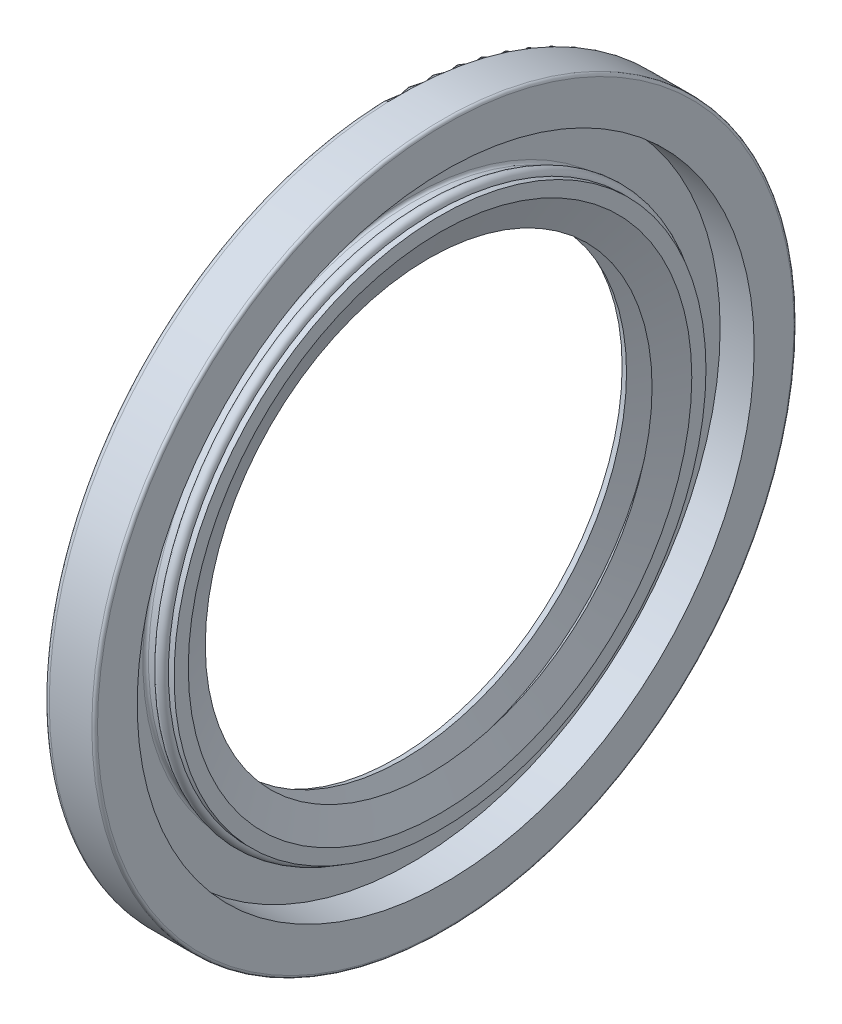
ISO-10303-21;
HEADER;
FILE_DESCRIPTION(('STEP AP214'),'2;1');
FILE_NAME('part.step','',(''),(''),'','','');
FILE_SCHEMA(('AUTOMOTIVE_DESIGN { 1 0 10303 214 1 1 1 1 }'));
ENDSEC;
DATA;
#1=APPLICATION_CONTEXT('core data for automotive mechanical design processes');
#2=APPLICATION_PROTOCOL_DEFINITION('international standard','automotive_design',2000,#1);
#3=PRODUCT_CONTEXT('',#1,'mechanical');
#4=PRODUCT('Part','Part','',(#3));
#5=PRODUCT_RELATED_PRODUCT_CATEGORY('part','',(#4));
#6=PRODUCT_DEFINITION_FORMATION('','',#4);
#7=PRODUCT_DEFINITION_CONTEXT('part definition',#1,'design');
#8=PRODUCT_DEFINITION('design','',#6,#7);
#9=PRODUCT_DEFINITION_SHAPE('','',#8);
#10=(LENGTH_UNIT() NAMED_UNIT(*) SI_UNIT(.MILLI.,.METRE.));
#11=(NAMED_UNIT(*) PLANE_ANGLE_UNIT() SI_UNIT($,.RADIAN.));
#12=(NAMED_UNIT(*) SI_UNIT($,.STERADIAN.) SOLID_ANGLE_UNIT());
#13=UNCERTAINTY_MEASURE_WITH_UNIT(LENGTH_MEASURE(1.E-05),#10,'distance_accuracy_value','');
#14=(GEOMETRIC_REPRESENTATION_CONTEXT(3) GLOBAL_UNCERTAINTY_ASSIGNED_CONTEXT((#13)) GLOBAL_UNIT_ASSIGNED_CONTEXT((#10,
#11,#12)) REPRESENTATION_CONTEXT('',''));
#15=CARTESIAN_POINT('',(0.,0.,0.));
#16=DIRECTION('',(0.,0.,1.));
#17=DIRECTION('',(1.,0.,0.));
#18=AXIS2_PLACEMENT_3D('',#15,#16,#17);
#19=CARTESIAN_POINT('',(0.,54.111111111111,0.));
#20=DIRECTION('',(-1.,0.,0.));
#21=DIRECTION('',(0.,0.,1.));
#22=AXIS2_PLACEMENT_3D('',#19,#20,#21);
#23=PLANE('',#22);
#24=CARTESIAN_POINT('',(0.,0.,0.));
#25=DIRECTION('',(1.,0.,0.));
#26=DIRECTION('',(0.,0.,-1.));
#27=AXIS2_PLACEMENT_3D('',#24,#25,#26);
#28=CIRCLE('',#27,48.333333333333);
#29=CARTESIAN_POINT('',(0.,0.,-48.333333333333));
#30=VERTEX_POINT('',#29);
#31=EDGE_CURVE('E108',#30,#30,#28,.T.);
#32=ORIENTED_EDGE('',*,*,#31,.T.);
#33=EDGE_LOOP('',(#32));
#34=FACE_BOUND('',#33,.T.);
#35=CARTESIAN_POINT('',(0.,0.,0.));
#36=DIRECTION('',(1.,0.,0.));
#37=DIRECTION('',(0.,0.,-1.));
#38=AXIS2_PLACEMENT_3D('',#35,#36,#37);
#39=CIRCLE('',#38,54.1111111111114);
#40=CARTESIAN_POINT('',(0.,0.,-54.1111111111114));
#41=VERTEX_POINT('',#40);
#42=EDGE_CURVE('E104',#41,#41,#39,.T.);
#43=ORIENTED_EDGE('',*,*,#42,.F.);
#44=EDGE_LOOP('',(#43));
#45=FACE_BOUND('',#44,.T.);
#46=ADVANCED_FACE('F15',(#34,#45),#23,.T.);
#47=CARTESIAN_POINT('',(8.,0.,0.));
#48=DIRECTION('',(1.,0.,0.));
#49=DIRECTION('',(0.,0.,-1.));
#50=AXIS2_PLACEMENT_3D('',#47,#48,#49);
#51=CYLINDRICAL_SURFACE('',#50,48.333333333333);
#52=CARTESIAN_POINT('',(0.2,0.,0.));
#53=DIRECTION('',(1.,0.,0.));
#54=DIRECTION('',(0.,0.,-1.));
#55=AXIS2_PLACEMENT_3D('',#52,#53,#54);
#56=CIRCLE('',#55,48.333333333333);
#57=CARTESIAN_POINT('',(0.2,0.,-48.333333333333));
#58=VERTEX_POINT('',#57);
#59=EDGE_CURVE('E100',#58,#58,#56,.T.);
#60=ORIENTED_EDGE('',*,*,#59,.T.);
#61=EDGE_LOOP('',(#60));
#62=FACE_BOUND('',#61,.T.);
#63=ORIENTED_EDGE('',*,*,#31,.F.);
#64=EDGE_LOOP('',(#63));
#65=FACE_BOUND('',#64,.T.);
#66=ADVANCED_FACE('F115',(#62,#65),#51,.F.);
#67=CARTESIAN_POINT('',(0.888888888888577,0.,0.));
#68=DIRECTION('',(1.,0.,0.));
#69=DIRECTION('',(0.,0.,-1.));
#70=AXIS2_PLACEMENT_3D('',#67,#68,#69);
#71=TOROIDAL_SURFACE('',#70,54.1111111111114,0.888888888888578);
#72=ORIENTED_EDGE('',*,*,#42,.T.);
#73=EDGE_LOOP('',(#72));
#74=FACE_BOUND('',#73,.T.);
#75=CARTESIAN_POINT('',(0.88888888888889,0.,0.));
#76=DIRECTION('',(1.,0.,0.));
#77=DIRECTION('',(0.,0.,-1.));
#78=AXIS2_PLACEMENT_3D('',#75,#76,#77);
#79=CIRCLE('',#78,55.);
#80=CARTESIAN_POINT('',(0.88888888888889,0.,-55.));
#81=VERTEX_POINT('',#80);
#82=EDGE_CURVE('E96',#81,#81,#79,.T.);
#83=ORIENTED_EDGE('',*,*,#82,.F.);
#84=EDGE_LOOP('',(#83));
#85=FACE_BOUND('',#84,.T.);
#86=ADVANCED_FACE('F117',(#74,#85),#71,.T.);
#87=CARTESIAN_POINT('',(0.2,48.333333333333,0.));
#88=DIRECTION('',(-1.,0.,0.));
#89=DIRECTION('',(0.,0.,1.));
#90=AXIS2_PLACEMENT_3D('',#87,#88,#89);
#91=PLANE('',#90);
#92=CARTESIAN_POINT('',(0.2,0.,0.));
#93=DIRECTION('',(1.,0.,0.));
#94=DIRECTION('',(0.,0.,-1.));
#95=AXIS2_PLACEMENT_3D('',#92,#93,#94);
#96=CIRCLE('',#95,41.666666666667);
#97=CARTESIAN_POINT('',(0.2,0.,-41.666666666667));
#98=VERTEX_POINT('',#97);
#99=EDGE_CURVE('E92',#98,#98,#96,.T.);
#100=ORIENTED_EDGE('',*,*,#99,.T.);
#101=EDGE_LOOP('',(#100));
#102=FACE_BOUND('',#101,.T.);
#103=ORIENTED_EDGE('',*,*,#59,.F.);
#104=EDGE_LOOP('',(#103));
#105=FACE_BOUND('',#104,.T.);
#106=ADVANCED_FACE('F125',(#102,#105),#91,.T.);
#107=CARTESIAN_POINT('',(8.,0.,0.));
#108=DIRECTION('',(1.,0.,0.));
#109=DIRECTION('',(0.,0.,-1.));
#110=AXIS2_PLACEMENT_3D('',#107,#108,#109);
#111=CYLINDRICAL_SURFACE('',#110,55.);
#112=ORIENTED_EDGE('',*,*,#82,.T.);
#113=EDGE_LOOP('',(#112));
#114=FACE_BOUND('',#113,.T.);
#115=CARTESIAN_POINT('',(7.5555555555556,0.,0.));
#116=DIRECTION('',(1.,0.,0.));
#117=DIRECTION('',(0.,0.,-1.));
#118=AXIS2_PLACEMENT_3D('',#115,#116,#117);
#119=CIRCLE('',#118,55.);
#120=CARTESIAN_POINT('',(7.5555555555556,0.,-55.));
#121=VERTEX_POINT('',#120);
#122=EDGE_CURVE('E88',#121,#121,#119,.T.);
#123=ORIENTED_EDGE('',*,*,#122,.F.);
#124=EDGE_LOOP('',(#123));
#125=FACE_BOUND('',#124,.T.);
#126=ADVANCED_FACE('F132',(#114,#125),#111,.T.);
#127=CARTESIAN_POINT('',(8.,0.,0.));
#128=DIRECTION('',(1.,0.,0.));
#129=DIRECTION('',(0.,0.,-1.));
#130=AXIS2_PLACEMENT_3D('',#127,#128,#129);
#131=CYLINDRICAL_SURFACE('',#130,41.666666666667);
#132=CARTESIAN_POINT('',(0.,0.,0.));
#133=DIRECTION('',(1.,0.,0.));
#134=DIRECTION('',(0.,0.,-1.));
#135=AXIS2_PLACEMENT_3D('',#132,#133,#134);
#136=CIRCLE('',#135,41.666666666667);
#137=CARTESIAN_POINT('',(0.,0.,-41.666666666667));
#138=VERTEX_POINT('',#137);
#139=EDGE_CURVE('E84',#138,#138,#136,.T.);
#140=ORIENTED_EDGE('',*,*,#139,.T.);
#141=EDGE_LOOP('',(#140));
#142=FACE_BOUND('',#141,.T.);
#143=ORIENTED_EDGE('',*,*,#99,.F.);
#144=EDGE_LOOP('',(#143));
#145=FACE_BOUND('',#144,.T.);
#146=ADVANCED_FACE('F136',(#142,#145),#131,.T.);
#147=CARTESIAN_POINT('',(7.5555555555557,0.,0.));
#148=DIRECTION('',(1.,0.,0.));
#149=DIRECTION('',(0.,0.,-1.));
#150=AXIS2_PLACEMENT_3D('',#147,#148,#149);
#151=TOROIDAL_SURFACE('',#150,54.5555555555557,0.444444444444303);
#152=ORIENTED_EDGE('',*,*,#122,.T.);
#153=EDGE_LOOP('',(#152));
#154=FACE_BOUND('',#153,.T.);
#155=CARTESIAN_POINT('',(8.,0.,0.));
#156=DIRECTION('',(1.,0.,0.));
#157=DIRECTION('',(0.,0.,-1.));
#158=AXIS2_PLACEMENT_3D('',#155,#156,#157);
#159=CIRCLE('',#158,54.5555556081221);
#160=CARTESIAN_POINT('',(8.,0.,-54.5555556081221));
#161=VERTEX_POINT('',#160);
#162=EDGE_CURVE('E80',#161,#161,#159,.T.);
#163=ORIENTED_EDGE('',*,*,#162,.F.);
#164=EDGE_LOOP('',(#163));
#165=FACE_BOUND('',#164,.T.);
#166=ADVANCED_FACE('F140',(#154,#165),#151,.T.);
#167=CARTESIAN_POINT('',(0.,41.666666666667,0.));
#168=DIRECTION('',(-1.,0.,0.));
#169=DIRECTION('',(0.,0.,1.));
#170=AXIS2_PLACEMENT_3D('',#167,#168,#169);
#171=PLANE('',#170);
#172=CARTESIAN_POINT('',(0.,0.,0.));
#173=DIRECTION('',(1.,0.,0.));
#174=DIRECTION('',(0.,0.,-1.));
#175=AXIS2_PLACEMENT_3D('',#172,#173,#174);
#176=CIRCLE('',#175,40.);
#177=CARTESIAN_POINT('',(0.,0.,-40.));
#178=VERTEX_POINT('',#177);
#179=EDGE_CURVE('E76',#178,#178,#176,.T.);
#180=ORIENTED_EDGE('',*,*,#179,.T.);
#181=EDGE_LOOP('',(#180));
#182=FACE_BOUND('',#181,.T.);
#183=ORIENTED_EDGE('',*,*,#139,.F.);
#184=EDGE_LOOP('',(#183));
#185=FACE_BOUND('',#184,.T.);
#186=ADVANCED_FACE('F144',(#182,#185),#171,.T.);
#187=CARTESIAN_POINT('',(8.,48.333333333333,0.));
#188=DIRECTION('',(1.,0.,0.));
#189=DIRECTION('',(0.,0.,-1.));
#190=AXIS2_PLACEMENT_3D('',#187,#188,#189);
#191=PLANE('',#190);
#192=ORIENTED_EDGE('',*,*,#162,.T.);
#193=EDGE_LOOP('',(#192));
#194=FACE_BOUND('',#193,.T.);
#195=CARTESIAN_POINT('',(8.,0.,0.));
#196=DIRECTION('',(1.,0.,0.));
#197=DIRECTION('',(0.,0.,-1.));
#198=AXIS2_PLACEMENT_3D('',#195,#196,#197);
#199=CIRCLE('',#198,48.333333333333);
#200=CARTESIAN_POINT('',(8.,0.,-48.333333333333));
#201=VERTEX_POINT('',#200);
#202=EDGE_CURVE('E72',#201,#201,#199,.T.);
#203=ORIENTED_EDGE('',*,*,#202,.F.);
#204=EDGE_LOOP('',(#203));
#205=FACE_BOUND('',#204,.T.);
#206=ADVANCED_FACE('F148',(#194,#205),#191,.T.);
#207=CARTESIAN_POINT('',(0.,0.,0.));
#208=DIRECTION('',(-1.,0.,0.));
#209=DIRECTION('',(0.,0.,1.));
#210=AXIS2_PLACEMENT_3D('',#207,#208,#209);
#211=CONICAL_SURFACE('',#210,40.,0.896055384571452);
#212=CARTESIAN_POINT('',(1.3333333333333,0.,0.));
#213=DIRECTION('',(1.,0.,0.));
#214=DIRECTION('',(0.,0.,-1.));
#215=AXIS2_PLACEMENT_3D('',#212,#213,#214);
#216=CIRCLE('',#215,38.333333333333);
#217=CARTESIAN_POINT('',(1.3333333333333,0.,-38.333333333333));
#218=VERTEX_POINT('',#217);
#219=EDGE_CURVE('E68',#218,#218,#216,.T.);
#220=ORIENTED_EDGE('',*,*,#219,.T.);
#221=EDGE_LOOP('',(#220));
#222=FACE_BOUND('',#221,.T.);
#223=ORIENTED_EDGE('',*,*,#179,.F.);
#224=EDGE_LOOP('',(#223));
#225=FACE_BOUND('',#224,.T.);
#226=ADVANCED_FACE('F152',(#222,#225),#211,.F.);
#227=CARTESIAN_POINT('',(8.,0.,0.));
#228=DIRECTION('',(1.,0.,0.));
#229=DIRECTION('',(0.,0.,-1.));
#230=AXIS2_PLACEMENT_3D('',#227,#228,#229);
#231=CYLINDRICAL_SURFACE('',#230,48.333333333333);
#232=ORIENTED_EDGE('',*,*,#202,.T.);
#233=EDGE_LOOP('',(#232));
#234=FACE_BOUND('',#233,.T.);
#235=CARTESIAN_POINT('',(2.6666666666667,0.,0.));
#236=DIRECTION('',(1.,0.,0.));
#237=DIRECTION('',(0.,0.,-1.));
#238=AXIS2_PLACEMENT_3D('',#235,#236,#237);
#239=CIRCLE('',#238,48.333333333333);
#240=CARTESIAN_POINT('',(2.6666666666667,0.,-48.333333333333));
#241=VERTEX_POINT('',#240);
#242=EDGE_CURVE('E64',#241,#241,#239,.T.);
#243=ORIENTED_EDGE('',*,*,#242,.F.);
#244=EDGE_LOOP('',(#243));
#245=FACE_BOUND('',#244,.T.);
#246=ADVANCED_FACE('F156',(#234,#245),#231,.F.);
#247=CARTESIAN_POINT('',(1.3333333333333,0.,0.));
#248=DIRECTION('',(1.,0.,0.));
#249=DIRECTION('',(0.,0.,-1.));
#250=AXIS2_PLACEMENT_3D('',#247,#248,#249);
#251=CONICAL_SURFACE('',#250,38.333333333333,1.19028994968245);
#252=CARTESIAN_POINT('',(0.183908045977011,0.,0.));
#253=DIRECTION('',(1.,0.,0.));
#254=DIRECTION('',(0.,0.,-1.));
#255=AXIS2_PLACEMENT_3D('',#252,#253,#254);
#256=CIRCLE('',#255,35.459770114943);
#257=CARTESIAN_POINT('',(0.183908045977011,0.,-35.459770114943));
#258=VERTEX_POINT('',#257);
#259=EDGE_CURVE('E60',#258,#258,#256,.T.);
#260=ORIENTED_EDGE('',*,*,#259,.T.);
#261=EDGE_LOOP('',(#260));
#262=FACE_BOUND('',#261,.T.);
#263=ORIENTED_EDGE('',*,*,#219,.F.);
#264=EDGE_LOOP('',(#263));
#265=FACE_BOUND('',#264,.T.);
#266=ADVANCED_FACE('F160',(#262,#265),#251,.T.);
#267=CARTESIAN_POINT('',(2.6666666666667,42.111111166667,0.));
#268=DIRECTION('',(1.,0.,0.));
#269=DIRECTION('',(0.,0.,-1.));
#270=AXIS2_PLACEMENT_3D('',#267,#268,#269);
#271=PLANE('',#270);
#272=ORIENTED_EDGE('',*,*,#242,.T.);
#273=EDGE_LOOP('',(#272));
#274=FACE_BOUND('',#273,.T.);
#275=CARTESIAN_POINT('',(2.6666666666667,0.,0.));
#276=DIRECTION('',(1.,0.,0.));
#277=DIRECTION('',(0.,0.,-1.));
#278=AXIS2_PLACEMENT_3D('',#275,#276,#277);
#279=CIRCLE('',#278,42.1111111393608);
#280=CARTESIAN_POINT('',(2.6666666666667,0.,-42.1111111393608));
#281=VERTEX_POINT('',#280);
#282=EDGE_CURVE('E56',#281,#281,#279,.T.);
#283=ORIENTED_EDGE('',*,*,#282,.F.);
#284=EDGE_LOOP('',(#283));
#285=FACE_BOUND('',#284,.T.);
#286=ADVANCED_FACE('F164',(#274,#285),#271,.T.);
#287=CARTESIAN_POINT('',(0.18390804597701,0.,0.));
#288=DIRECTION('',(-1.,0.,0.));
#289=DIRECTION('',(0.,0.,1.));
#290=AXIS2_PLACEMENT_3D('',#287,#288,#289);
#291=CONICAL_SURFACE('',#290,35.459770114943,0.380506377112727);
#292=CARTESIAN_POINT('',(1.3333333333333,0.,0.));
#293=DIRECTION('',(1.,0.,0.));
#294=DIRECTION('',(0.,0.,-1.));
#295=AXIS2_PLACEMENT_3D('',#292,#293,#294);
#296=CIRCLE('',#295,35.);
#297=CARTESIAN_POINT('',(1.3333333333333,0.,-35.));
#298=VERTEX_POINT('',#297);
#299=EDGE_CURVE('E52',#298,#298,#296,.T.);
#300=ORIENTED_EDGE('',*,*,#299,.T.);
#301=EDGE_LOOP('',(#300));
#302=FACE_BOUND('',#301,.T.);
#303=ORIENTED_EDGE('',*,*,#259,.F.);
#304=EDGE_LOOP('',(#303));
#305=FACE_BOUND('',#304,.T.);
#306=ADVANCED_FACE('F168',(#302,#305),#291,.F.);
#307=CARTESIAN_POINT('',(3.11111116666675,0.,0.));
#308=DIRECTION('',(1.,0.,0.));
#309=DIRECTION('',(0.,0.,-1.));
#310=AXIS2_PLACEMENT_3D('',#307,#308,#309);
#311=TOROIDAL_SURFACE('',#310,42.1111111666671,0.44444450000005);
#312=CARTESIAN_POINT('',(3.1111111666667,0.,0.));
#313=DIRECTION('',(1.,0.,0.));
#314=DIRECTION('',(0.,0.,-1.));
#315=AXIS2_PLACEMENT_3D('',#312,#313,#314);
#316=CIRCLE('',#315,41.666666666667);
#317=CARTESIAN_POINT('',(3.1111111666667,0.,-41.666666666667));
#318=VERTEX_POINT('',#317);
#319=EDGE_CURVE('E48',#318,#318,#316,.T.);
#320=ORIENTED_EDGE('',*,*,#319,.F.);
#321=EDGE_LOOP('',(#320));
#322=FACE_BOUND('',#321,.T.);
#323=ORIENTED_EDGE('',*,*,#282,.T.);
#324=EDGE_LOOP('',(#323));
#325=FACE_BOUND('',#324,.T.);
#326=ADVANCED_FACE('F172',(#322,#325),#311,.F.);
#327=CARTESIAN_POINT('',(1.3333333333333,0.,0.));
#328=DIRECTION('',(1.,0.,0.));
#329=DIRECTION('',(0.,0.,-1.));
#330=AXIS2_PLACEMENT_3D('',#327,#328,#329);
#331=CONICAL_SURFACE('',#330,35.,1.19028994968248);
#332=CARTESIAN_POINT('',(2.6666666666667,0.,0.));
#333=DIRECTION('',(1.,0.,0.));
#334=DIRECTION('',(0.,0.,-1.));
#335=AXIS2_PLACEMENT_3D('',#332,#333,#334);
#336=CIRCLE('',#335,38.333333333333);
#337=CARTESIAN_POINT('',(2.6666666666667,0.,-38.333333333333));
#338=VERTEX_POINT('',#337);
#339=EDGE_CURVE('E44',#338,#338,#336,.T.);
#340=ORIENTED_EDGE('',*,*,#339,.T.);
#341=EDGE_LOOP('',(#340));
#342=FACE_BOUND('',#341,.T.);
#343=ORIENTED_EDGE('',*,*,#299,.F.);
#344=EDGE_LOOP('',(#343));
#345=FACE_BOUND('',#344,.T.);
#346=ADVANCED_FACE('F176',(#342,#345),#331,.F.);
#347=CARTESIAN_POINT('',(8.,0.,0.));
#348=DIRECTION('',(1.,0.,0.));
#349=DIRECTION('',(0.,0.,-1.));
#350=AXIS2_PLACEMENT_3D('',#347,#348,#349);
#351=CYLINDRICAL_SURFACE('',#350,41.666666666667);
#352=ORIENTED_EDGE('',*,*,#319,.T.);
#353=EDGE_LOOP('',(#352));
#354=FACE_BOUND('',#353,.T.);
#355=CARTESIAN_POINT('',(4.4444443333333,0.,0.));
#356=DIRECTION('',(1.,0.,0.));
#357=DIRECTION('',(0.,0.,-1.));
#358=AXIS2_PLACEMENT_3D('',#355,#356,#357);
#359=CIRCLE('',#358,41.666666666667);
#360=CARTESIAN_POINT('',(4.4444443333333,0.,-41.666666666667));
#361=VERTEX_POINT('',#360);
#362=EDGE_CURVE('E40',#361,#361,#359,.T.);
#363=ORIENTED_EDGE('',*,*,#362,.F.);
#364=EDGE_LOOP('',(#363));
#365=FACE_BOUND('',#364,.T.);
#366=ADVANCED_FACE('F180',(#354,#365),#351,.T.);
#367=CARTESIAN_POINT('',(2.6666666666667,0.,0.));
#368=DIRECTION('',(-1.,0.,0.));
#369=DIRECTION('',(0.,0.,1.));
#370=AXIS2_PLACEMENT_3D('',#367,#368,#369);
#371=CONICAL_SURFACE('',#370,38.333333333333,0.896055384571307);
#372=CARTESIAN_POINT('',(5.3333333333333,0.,0.));
#373=DIRECTION('',(1.,0.,0.));
#374=DIRECTION('',(0.,0.,-1.));
#375=AXIS2_PLACEMENT_3D('',#372,#373,#374);
#376=CIRCLE('',#375,35.);
#377=CARTESIAN_POINT('',(5.3333333333333,0.,-35.));
#378=VERTEX_POINT('',#377);
#379=EDGE_CURVE('E34',#378,#378,#376,.T.);
#380=ORIENTED_EDGE('',*,*,#379,.T.);
#381=EDGE_LOOP('',(#380));
#382=FACE_BOUND('',#381,.T.);
#383=ORIENTED_EDGE('',*,*,#339,.F.);
#384=EDGE_LOOP('',(#383));
#385=FACE_BOUND('',#384,.T.);
#386=ADVANCED_FACE('F184',(#382,#385),#371,.F.);
#387=CARTESIAN_POINT('',(5.3333333333333,0.,0.));
#388=DIRECTION('',(1.,0.,0.));
#389=DIRECTION('',(0.,0.,-1.));
#390=AXIS2_PLACEMENT_3D('',#387,#388,#389);
#391=TOROIDAL_SURFACE('',#390,41.666666666667,0.888889);
#392=ORIENTED_EDGE('',*,*,#362,.T.);
#393=EDGE_LOOP('',(#392));
#394=FACE_BOUND('',#393,.T.);
#395=CARTESIAN_POINT('',(6.2222223333333,0.,0.));
#396=DIRECTION('',(1.,0.,0.));
#397=DIRECTION('',(0.,0.,-1.));
#398=AXIS2_PLACEMENT_3D('',#395,#396,#397);
#399=CIRCLE('',#398,41.666666666667);
#400=CARTESIAN_POINT('',(6.2222223333333,0.,-41.666666666667));
#401=VERTEX_POINT('',#400);
#402=EDGE_CURVE('E29',#401,#401,#399,.T.);
#403=ORIENTED_EDGE('',*,*,#402,.F.);
#404=EDGE_LOOP('',(#403));
#405=FACE_BOUND('',#404,.T.);
#406=ADVANCED_FACE('F188',(#394,#405),#391,.T.);
#407=CARTESIAN_POINT('',(5.3333333333333,0.,0.));
#408=DIRECTION('',(1.,0.,0.));
#409=DIRECTION('',(0.,0.,-1.));
#410=AXIS2_PLACEMENT_3D('',#407,#408,#409);
#411=CONICAL_SURFACE('',#410,35.,1.19028994968249);
#412=CARTESIAN_POINT('',(7.1111111666667,0.,0.));
#413=DIRECTION('',(1.,0.,0.));
#414=DIRECTION('',(0.,0.,-1.));
#415=AXIS2_PLACEMENT_3D('',#412,#413,#414);
#416=CIRCLE('',#415,39.444444583333);
#417=CARTESIAN_POINT('',(7.1111111666667,0.,-39.444444583333));
#418=VERTEX_POINT('',#417);
#419=EDGE_CURVE('E23',#418,#418,#416,.T.);
#420=ORIENTED_EDGE('',*,*,#419,.T.);
#421=EDGE_LOOP('',(#420));
#422=FACE_BOUND('',#421,.T.);
#423=ORIENTED_EDGE('',*,*,#379,.F.);
#424=EDGE_LOOP('',(#423));
#425=FACE_BOUND('',#424,.T.);
#426=ADVANCED_FACE('F192',(#422,#425),#411,.F.);
#427=CARTESIAN_POINT('',(8.,0.,0.));
#428=DIRECTION('',(1.,0.,0.));
#429=DIRECTION('',(0.,0.,-1.));
#430=AXIS2_PLACEMENT_3D('',#427,#428,#429);
#431=CYLINDRICAL_SURFACE('',#430,41.666666666667);
#432=ORIENTED_EDGE('',*,*,#402,.T.);
#433=EDGE_LOOP('',(#432));
#434=FACE_BOUND('',#433,.T.);
#435=CARTESIAN_POINT('',(7.1111111666667,0.,0.));
#436=DIRECTION('',(1.,0.,0.));
#437=DIRECTION('',(0.,0.,-1.));
#438=AXIS2_PLACEMENT_3D('',#435,#436,#437);
#439=CIRCLE('',#438,41.666666666667);
#440=CARTESIAN_POINT('',(7.1111111666667,0.,-41.666666666667));
#441=VERTEX_POINT('',#440);
#442=EDGE_CURVE('E10',#441,#441,#439,.T.);
#443=ORIENTED_EDGE('',*,*,#442,.F.);
#444=EDGE_LOOP('',(#443));
#445=FACE_BOUND('',#444,.T.);
#446=ADVANCED_FACE('F195',(#434,#445),#431,.T.);
#447=CARTESIAN_POINT('',(7.1111111666667,39.444444583333,0.));
#448=DIRECTION('',(1.,0.,0.));
#449=DIRECTION('',(0.,0.,-1.));
#450=AXIS2_PLACEMENT_3D('',#447,#448,#449);
#451=PLANE('',#450);
#452=ORIENTED_EDGE('',*,*,#442,.T.);
#453=EDGE_LOOP('',(#452));
#454=FACE_BOUND('',#453,.T.);
#455=ORIENTED_EDGE('',*,*,#419,.F.);
#456=EDGE_LOOP('',(#455));
#457=FACE_BOUND('',#456,.T.);
#458=ADVANCED_FACE('F17',(#454,#457),#451,.T.);
#459=CLOSED_SHELL('',(#46,#66,#86,#106,#126,#146,#166,#186,#206,#226,#246,#266,#286,#306,#326,
#346,#366,#386,#406,#426,#446,#458));
#460=MANIFOLD_SOLID_BREP('B1',#459);
#461=ADVANCED_BREP_SHAPE_REPRESENTATION('',(#18,#460),#14);
#462=SHAPE_DEFINITION_REPRESENTATION(#9,#461);
ENDSEC;
END-ISO-10303-21;
